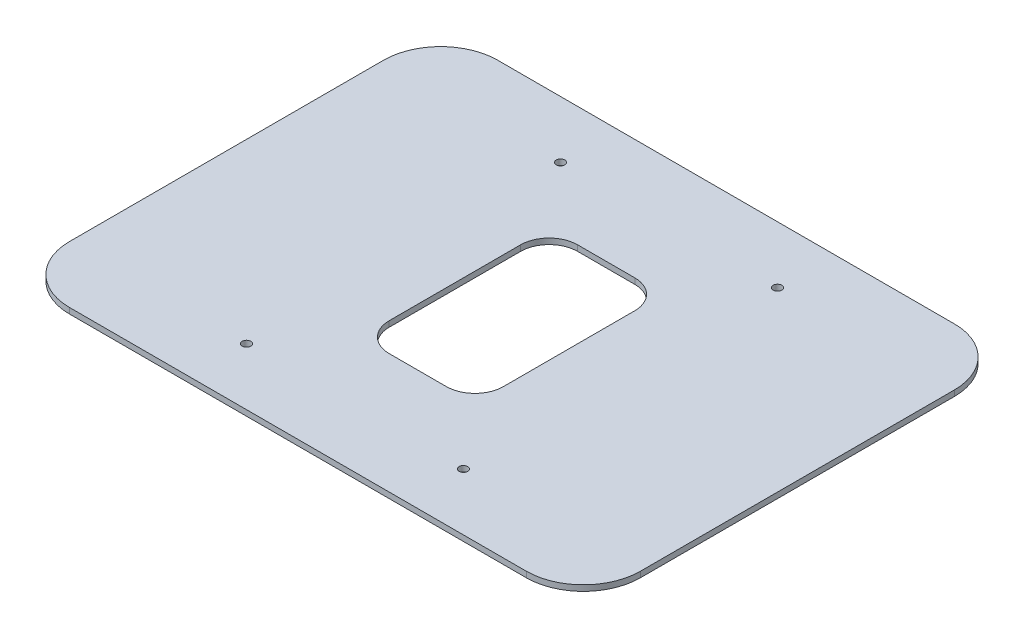
ISO-10303-21;
HEADER;
FILE_DESCRIPTION(('STEP AP214'),'2;1');
FILE_NAME('part.step','',(''),(''),'','','');
FILE_SCHEMA(('AUTOMOTIVE_DESIGN { 1 0 10303 214 1 1 1 1 }'));
ENDSEC;
DATA;
#1=APPLICATION_CONTEXT('core data for automotive mechanical design processes');
#2=APPLICATION_PROTOCOL_DEFINITION('international standard','automotive_design',2000,#1);
#3=PRODUCT_CONTEXT('',#1,'mechanical');
#4=PRODUCT('Part','Part','',(#3));
#5=PRODUCT_RELATED_PRODUCT_CATEGORY('part','',(#4));
#6=PRODUCT_DEFINITION_FORMATION('','',#4);
#7=PRODUCT_DEFINITION_CONTEXT('part definition',#1,'design');
#8=PRODUCT_DEFINITION('design','',#6,#7);
#9=PRODUCT_DEFINITION_SHAPE('','',#8);
#10=(LENGTH_UNIT() NAMED_UNIT(*) SI_UNIT(.MILLI.,.METRE.));
#11=(NAMED_UNIT(*) PLANE_ANGLE_UNIT() SI_UNIT($,.RADIAN.));
#12=(NAMED_UNIT(*) SI_UNIT($,.STERADIAN.) SOLID_ANGLE_UNIT());
#13=UNCERTAINTY_MEASURE_WITH_UNIT(LENGTH_MEASURE(1.E-05),#10,'distance_accuracy_value','');
#14=(GEOMETRIC_REPRESENTATION_CONTEXT(3) GLOBAL_UNCERTAINTY_ASSIGNED_CONTEXT((#13)) GLOBAL_UNIT_ASSIGNED_CONTEXT((#10,
#11,#12)) REPRESENTATION_CONTEXT('',''));
#15=CARTESIAN_POINT('',(0.,0.,0.));
#16=DIRECTION('',(0.,0.,1.));
#17=DIRECTION('',(1.,0.,0.));
#18=AXIS2_PLACEMENT_3D('',#15,#16,#17);
#19=CARTESIAN_POINT('',(119.18397760156,2.,-163.114483400198));
#20=DIRECTION('',(0.,-1.,0.));
#21=DIRECTION('',(0.,0.,-1.));
#22=AXIS2_PLACEMENT_3D('',#19,#20,#21);
#23=CYLINDRICAL_SURFACE('',#22,20.);
#24=CARTESIAN_POINT('',(119.18397760156,0.,-163.114483400198));
#25=DIRECTION('',(0.,1.,0.));
#26=DIRECTION('',(0.,0.,-1.));
#27=AXIS2_PLACEMENT_3D('',#24,#25,#26);
#28=CIRCLE('',#27,20.);
#29=CARTESIAN_POINT('',(139.18397760156,0.,-163.114483400198));
#30=VERTEX_POINT('',#29);
#31=CARTESIAN_POINT('',(119.18397760156,0.,-183.114483400198));
#32=VERTEX_POINT('',#31);
#33=EDGE_CURVE('E227',#30,#32,#28,.T.);
#34=ORIENTED_EDGE('',*,*,#33,.T.);
#35=DIRECTION('',(0.,-1.,0.));
#36=VECTOR('',#35,1.);
#37=CARTESIAN_POINT('',(119.18397760156,2.,-183.114483400198));
#38=LINE('',#37,#36);
#39=CARTESIAN_POINT('',(119.18397760156,2.,-183.114483400198));
#40=VERTEX_POINT('',#39);
#41=EDGE_CURVE('E263',#40,#32,#38,.T.);
#42=ORIENTED_EDGE('',*,*,#41,.F.);
#43=CARTESIAN_POINT('',(119.18397760156,2.,-163.114483400198));
#44=DIRECTION('',(0.,1.,0.));
#45=DIRECTION('',(0.,0.,-1.));
#46=AXIS2_PLACEMENT_3D('',#43,#44,#45);
#47=CIRCLE('',#46,20.);
#48=CARTESIAN_POINT('',(139.18397760156,2.,-163.114483400198));
#49=VERTEX_POINT('',#48);
#50=EDGE_CURVE('E208',#49,#40,#47,.T.);
#51=ORIENTED_EDGE('',*,*,#50,.F.);
#52=DIRECTION('',(0.,-1.,0.));
#53=VECTOR('',#52,1.);
#54=CARTESIAN_POINT('',(139.18397760156,2.,-163.114483400198));
#55=LINE('',#54,#53);
#56=EDGE_CURVE('E226',#49,#30,#55,.T.);
#57=ORIENTED_EDGE('',*,*,#56,.T.);
#58=EDGE_LOOP('',(#34,#42,#51,#57));
#59=FACE_BOUND('',#58,.T.);
#60=ADVANCED_FACE('F33',(#59),#23,.T.);
#61=CARTESIAN_POINT('',(-40.81602239844,2.,-183.114483400198));
#62=DIRECTION('',(0.,0.,1.));
#63=DIRECTION('',(1.,0.,0.));
#64=AXIS2_PLACEMENT_3D('',#61,#62,#63);
#65=PLANE('',#64);
#66=DIRECTION('',(-1.,0.,0.));
#67=VECTOR('',#66,1.);
#68=CARTESIAN_POINT('',(-40.81602239844,0.,-183.114483400198));
#69=LINE('',#68,#67);
#70=CARTESIAN_POINT('',(-40.81602239844,0.,-183.114483400198));
#71=VERTEX_POINT('',#70);
#72=EDGE_CURVE('E230',#32,#71,#69,.T.);
#73=ORIENTED_EDGE('',*,*,#72,.T.);
#74=DIRECTION('',(0.,-1.,0.));
#75=VECTOR('',#74,1.);
#76=CARTESIAN_POINT('',(-40.81602239844,2.,-183.114483400198));
#77=LINE('',#76,#75);
#78=CARTESIAN_POINT('',(-40.81602239844,2.,-183.114483400198));
#79=VERTEX_POINT('',#78);
#80=EDGE_CURVE('E260',#79,#71,#77,.T.);
#81=ORIENTED_EDGE('',*,*,#80,.F.);
#82=DIRECTION('',(-1.,0.,0.));
#83=VECTOR('',#82,1.);
#84=CARTESIAN_POINT('',(-40.81602239844,2.,-183.114483400198));
#85=LINE('',#84,#83);
#86=EDGE_CURVE('E211',#40,#79,#85,.T.);
#87=ORIENTED_EDGE('',*,*,#86,.F.);
#88=ORIENTED_EDGE('',*,*,#41,.T.);
#89=EDGE_LOOP('',(#73,#81,#87,#88));
#90=FACE_BOUND('',#89,.T.);
#91=ADVANCED_FACE('F326',(#90),#65,.F.);
#92=CARTESIAN_POINT('',(-40.81602239844,2.,-163.114483400198));
#93=DIRECTION('',(0.,-1.,0.));
#94=DIRECTION('',(0.,0.,-1.));
#95=AXIS2_PLACEMENT_3D('',#92,#93,#94);
#96=CYLINDRICAL_SURFACE('',#95,20.);
#97=CARTESIAN_POINT('',(-40.81602239844,0.,-163.114483400198));
#98=DIRECTION('',(0.,1.,0.));
#99=DIRECTION('',(0.,0.,1.));
#100=AXIS2_PLACEMENT_3D('',#97,#98,#99);
#101=CIRCLE('',#100,20.);
#102=CARTESIAN_POINT('',(-60.81602239844,0.,-163.114483400198));
#103=VERTEX_POINT('',#102);
#104=EDGE_CURVE('E232',#71,#103,#101,.T.);
#105=ORIENTED_EDGE('',*,*,#104,.T.);
#106=DIRECTION('',(0.,-1.,0.));
#107=VECTOR('',#106,1.);
#108=CARTESIAN_POINT('',(-60.81602239844,2.,-163.114483400198));
#109=LINE('',#108,#107);
#110=CARTESIAN_POINT('',(-60.81602239844,2.,-163.114483400198));
#111=VERTEX_POINT('',#110);
#112=EDGE_CURVE('E257',#111,#103,#109,.T.);
#113=ORIENTED_EDGE('',*,*,#112,.F.);
#114=CARTESIAN_POINT('',(-40.81602239844,2.,-163.114483400198));
#115=DIRECTION('',(0.,1.,0.));
#116=DIRECTION('',(0.,0.,1.));
#117=AXIS2_PLACEMENT_3D('',#114,#115,#116);
#118=CIRCLE('',#117,20.);
#119=EDGE_CURVE('E214',#79,#111,#118,.T.);
#120=ORIENTED_EDGE('',*,*,#119,.F.);
#121=ORIENTED_EDGE('',*,*,#80,.T.);
#122=EDGE_LOOP('',(#105,#113,#120,#121));
#123=FACE_BOUND('',#122,.T.);
#124=ADVANCED_FACE('F331',(#123),#96,.T.);
#125=CARTESIAN_POINT('',(-60.81602239844,2.,-163.114483400198));
#126=DIRECTION('',(1.,0.,0.));
#127=DIRECTION('',(0.,0.,-1.));
#128=AXIS2_PLACEMENT_3D('',#125,#126,#127);
#129=PLANE('',#128);
#130=DIRECTION('',(0.,0.,1.));
#131=VECTOR('',#130,1.);
#132=CARTESIAN_POINT('',(-60.81602239844,0.,-163.114483400198));
#133=LINE('',#132,#131);
#134=CARTESIAN_POINT('',(-60.81602239844,0.,-53.1144834001978));
#135=VERTEX_POINT('',#134);
#136=EDGE_CURVE('E234',#103,#135,#133,.T.);
#137=ORIENTED_EDGE('',*,*,#136,.T.);
#138=DIRECTION('',(0.,-1.,0.));
#139=VECTOR('',#138,1.);
#140=CARTESIAN_POINT('',(-60.81602239844,2.,-53.1144834001978));
#141=LINE('',#140,#139);
#142=CARTESIAN_POINT('',(-60.81602239844,2.,-53.1144834001978));
#143=VERTEX_POINT('',#142);
#144=EDGE_CURVE('E254',#143,#135,#141,.T.);
#145=ORIENTED_EDGE('',*,*,#144,.F.);
#146=DIRECTION('',(0.,0.,1.));
#147=VECTOR('',#146,1.);
#148=CARTESIAN_POINT('',(-60.81602239844,2.,-163.114483400198));
#149=LINE('',#148,#147);
#150=EDGE_CURVE('E216',#111,#143,#149,.T.);
#151=ORIENTED_EDGE('',*,*,#150,.F.);
#152=ORIENTED_EDGE('',*,*,#112,.T.);
#153=EDGE_LOOP('',(#137,#145,#151,#152));
#154=FACE_BOUND('',#153,.T.);
#155=ADVANCED_FACE('F365',(#154),#129,.F.);
#156=CARTESIAN_POINT('',(-40.81602239844,2.,-53.1144834001977));
#157=DIRECTION('',(0.,-1.,0.));
#158=DIRECTION('',(0.,0.,-1.));
#159=AXIS2_PLACEMENT_3D('',#156,#157,#158);
#160=CYLINDRICAL_SURFACE('',#159,20.);
#161=CARTESIAN_POINT('',(-40.81602239844,0.,-53.1144834001977));
#162=DIRECTION('',(0.,1.,0.));
#163=DIRECTION('',(0.,0.,1.));
#164=AXIS2_PLACEMENT_3D('',#161,#162,#163);
#165=CIRCLE('',#164,20.);
#166=CARTESIAN_POINT('',(-40.81602239844,0.,-33.1144834001977));
#167=VERTEX_POINT('',#166);
#168=EDGE_CURVE('E236',#135,#167,#165,.T.);
#169=ORIENTED_EDGE('',*,*,#168,.T.);
#170=DIRECTION('',(0.,-1.,0.));
#171=VECTOR('',#170,1.);
#172=CARTESIAN_POINT('',(-40.81602239844,2.,-33.1144834001977));
#173=LINE('',#172,#171);
#174=CARTESIAN_POINT('',(-40.81602239844,2.,-33.1144834001977));
#175=VERTEX_POINT('',#174);
#176=EDGE_CURVE('E251',#175,#167,#173,.T.);
#177=ORIENTED_EDGE('',*,*,#176,.F.);
#178=CARTESIAN_POINT('',(-40.81602239844,2.,-53.1144834001977));
#179=DIRECTION('',(0.,1.,0.));
#180=DIRECTION('',(0.,0.,1.));
#181=AXIS2_PLACEMENT_3D('',#178,#179,#180);
#182=CIRCLE('',#181,20.);
#183=EDGE_CURVE('E218',#143,#175,#182,.T.);
#184=ORIENTED_EDGE('',*,*,#183,.F.);
#185=ORIENTED_EDGE('',*,*,#144,.T.);
#186=EDGE_LOOP('',(#169,#177,#184,#185));
#187=FACE_BOUND('',#186,.T.);
#188=ADVANCED_FACE('F361',(#187),#160,.T.);
#189=CARTESIAN_POINT('',(-40.8160223984398,2.,-33.1144834001977));
#190=DIRECTION('',(0.,0.,-1.));
#191=DIRECTION('',(-1.,0.,0.));
#192=AXIS2_PLACEMENT_3D('',#189,#190,#191);
#193=PLANE('',#192);
#194=DIRECTION('',(1.,0.,0.));
#195=VECTOR('',#194,1.);
#196=CARTESIAN_POINT('',(-40.8160223984398,0.,-33.1144834001977));
#197=LINE('',#196,#195);
#198=CARTESIAN_POINT('',(119.18397760156,0.,-33.1144834001977));
#199=VERTEX_POINT('',#198);
#200=EDGE_CURVE('E238',#167,#199,#197,.T.);
#201=ORIENTED_EDGE('',*,*,#200,.T.);
#202=DIRECTION('',(0.,-1.,0.));
#203=VECTOR('',#202,1.);
#204=CARTESIAN_POINT('',(119.18397760156,2.,-33.1144834001977));
#205=LINE('',#204,#203);
#206=CARTESIAN_POINT('',(119.18397760156,2.,-33.1144834001977));
#207=VERTEX_POINT('',#206);
#208=EDGE_CURVE('E248',#207,#199,#205,.T.);
#209=ORIENTED_EDGE('',*,*,#208,.F.);
#210=DIRECTION('',(1.,0.,0.));
#211=VECTOR('',#210,1.);
#212=CARTESIAN_POINT('',(-40.8160223984398,2.,-33.1144834001977));
#213=LINE('',#212,#211);
#214=EDGE_CURVE('E220',#175,#207,#213,.T.);
#215=ORIENTED_EDGE('',*,*,#214,.F.);
#216=ORIENTED_EDGE('',*,*,#176,.T.);
#217=EDGE_LOOP('',(#201,#209,#215,#216));
#218=FACE_BOUND('',#217,.T.);
#219=ADVANCED_FACE('F356',(#218),#193,.F.);
#220=CARTESIAN_POINT('',(119.18397760156,2.,-53.1144834001977));
#221=DIRECTION('',(0.,-1.,0.));
#222=DIRECTION('',(0.,0.,-1.));
#223=AXIS2_PLACEMENT_3D('',#220,#221,#222);
#224=CYLINDRICAL_SURFACE('',#223,20.);
#225=CARTESIAN_POINT('',(119.18397760156,0.,-53.1144834001977));
#226=DIRECTION('',(0.,1.,0.));
#227=DIRECTION('',(0.,0.,1.));
#228=AXIS2_PLACEMENT_3D('',#225,#226,#227);
#229=CIRCLE('',#228,20.);
#230=CARTESIAN_POINT('',(139.18397760156,0.,-53.1144834001977));
#231=VERTEX_POINT('',#230);
#232=EDGE_CURVE('E240',#199,#231,#229,.T.);
#233=ORIENTED_EDGE('',*,*,#232,.T.);
#234=DIRECTION('',(0.,-1.,0.));
#235=VECTOR('',#234,1.);
#236=CARTESIAN_POINT('',(139.18397760156,2.,-53.1144834001977));
#237=LINE('',#236,#235);
#238=CARTESIAN_POINT('',(139.18397760156,2.,-53.1144834001977));
#239=VERTEX_POINT('',#238);
#240=EDGE_CURVE('E245',#239,#231,#237,.T.);
#241=ORIENTED_EDGE('',*,*,#240,.F.);
#242=CARTESIAN_POINT('',(119.18397760156,2.,-53.1144834001977));
#243=DIRECTION('',(0.,1.,0.));
#244=DIRECTION('',(0.,0.,1.));
#245=AXIS2_PLACEMENT_3D('',#242,#243,#244);
#246=CIRCLE('',#245,20.);
#247=EDGE_CURVE('E222',#207,#239,#246,.T.);
#248=ORIENTED_EDGE('',*,*,#247,.F.);
#249=ORIENTED_EDGE('',*,*,#208,.T.);
#250=EDGE_LOOP('',(#233,#241,#248,#249));
#251=FACE_BOUND('',#250,.T.);
#252=ADVANCED_FACE('F351',(#251),#224,.T.);
#253=CARTESIAN_POINT('',(139.18397760156,2.,-163.114483400198));
#254=DIRECTION('',(-1.,0.,0.));
#255=DIRECTION('',(0.,0.,1.));
#256=AXIS2_PLACEMENT_3D('',#253,#254,#255);
#257=PLANE('',#256);
#258=DIRECTION('',(0.,0.,-1.));
#259=VECTOR('',#258,1.);
#260=CARTESIAN_POINT('',(139.18397760156,0.,-163.114483400198));
#261=LINE('',#260,#259);
#262=EDGE_CURVE('E212',#231,#30,#261,.T.);
#263=ORIENTED_EDGE('',*,*,#262,.T.);
#264=ORIENTED_EDGE('',*,*,#56,.F.);
#265=DIRECTION('',(0.,0.,-1.));
#266=VECTOR('',#265,1.);
#267=CARTESIAN_POINT('',(139.18397760156,2.,-163.114483400198));
#268=LINE('',#267,#266);
#269=EDGE_CURVE('E224',#239,#49,#268,.T.);
#270=ORIENTED_EDGE('',*,*,#269,.F.);
#271=ORIENTED_EDGE('',*,*,#240,.T.);
#272=EDGE_LOOP('',(#263,#264,#270,#271));
#273=FACE_BOUND('',#272,.T.);
#274=ADVANCED_FACE('F349',(#273),#257,.F.);
#275=CARTESIAN_POINT('',(119.18397760156,2.,-163.114483400198));
#276=DIRECTION('',(0.,-1.,0.));
#277=DIRECTION('',(0.,0.,-1.));
#278=AXIS2_PLACEMENT_3D('',#275,#276,#277);
#279=PLANE('',#278);
#280=DIRECTION('',(-1.,0.,0.));
#281=VECTOR('',#280,1.);
#282=CARTESIAN_POINT('',(29.1839776015601,2.,-141.114483400198));
#283=LINE('',#282,#281);
#284=CARTESIAN_POINT('',(49.1839776015599,2.,-141.114483400198));
#285=VERTEX_POINT('',#284);
#286=CARTESIAN_POINT('',(29.1839776015601,2.,-141.114483400198));
#287=VERTEX_POINT('',#286);
#288=EDGE_CURVE('E156',#285,#287,#283,.T.);
#289=ORIENTED_EDGE('',*,*,#288,.F.);
#290=CARTESIAN_POINT('',(49.18397760156,2.,-131.114483400198));
#291=DIRECTION('',(0.,1.,0.));
#292=DIRECTION('',(0.,0.,-1.));
#293=AXIS2_PLACEMENT_3D('',#290,#291,#292);
#294=CIRCLE('',#293,10.);
#295=CARTESIAN_POINT('',(59.18397760156,2.,-131.114483400198));
#296=VERTEX_POINT('',#295);
#297=EDGE_CURVE('E47',#296,#285,#294,.T.);
#298=ORIENTED_EDGE('',*,*,#297,.F.);
#299=DIRECTION('',(0.,0.,-1.));
#300=VECTOR('',#299,1.);
#301=CARTESIAN_POINT('',(59.18397760156,2.,-131.114483400198));
#302=LINE('',#301,#300);
#303=CARTESIAN_POINT('',(59.18397760156,2.,-85.1144834001978));
#304=VERTEX_POINT('',#303);
#305=EDGE_CURVE('E178',#304,#296,#302,.T.);
#306=ORIENTED_EDGE('',*,*,#305,.F.);
#307=CARTESIAN_POINT('',(49.18397760156,2.,-85.1144834001977));
#308=DIRECTION('',(0.,1.,0.));
#309=DIRECTION('',(0.,0.,1.));
#310=AXIS2_PLACEMENT_3D('',#307,#308,#309);
#311=CIRCLE('',#310,10.);
#312=CARTESIAN_POINT('',(49.1839776015599,2.,-75.1144834001977));
#313=VERTEX_POINT('',#312);
#314=EDGE_CURVE('E175',#313,#304,#311,.T.);
#315=ORIENTED_EDGE('',*,*,#314,.F.);
#316=DIRECTION('',(1.,0.,0.));
#317=VECTOR('',#316,1.);
#318=CARTESIAN_POINT('',(29.1839776015601,2.,-75.1144834001977));
#319=LINE('',#318,#317);
#320=CARTESIAN_POINT('',(29.18397760156,2.,-75.1144834001977));
#321=VERTEX_POINT('',#320);
#322=EDGE_CURVE('E172',#321,#313,#319,.T.);
#323=ORIENTED_EDGE('',*,*,#322,.F.);
#324=CARTESIAN_POINT('',(29.18397760156,2.,-85.1144834001977));
#325=DIRECTION('',(0.,1.,0.));
#326=DIRECTION('',(0.,0.,1.));
#327=AXIS2_PLACEMENT_3D('',#324,#325,#326);
#328=CIRCLE('',#327,10.);
#329=CARTESIAN_POINT('',(19.18397760156,2.,-85.1144834001978));
#330=VERTEX_POINT('',#329);
#331=EDGE_CURVE('E166',#330,#321,#328,.T.);
#332=ORIENTED_EDGE('',*,*,#331,.F.);
#333=DIRECTION('',(0.,0.,1.));
#334=VECTOR('',#333,1.);
#335=CARTESIAN_POINT('',(19.18397760156,2.,-131.114483400198));
#336=LINE('',#335,#334);
#337=CARTESIAN_POINT('',(19.18397760156,2.,-131.114483400198));
#338=VERTEX_POINT('',#337);
#339=EDGE_CURVE('E164',#338,#330,#336,.T.);
#340=ORIENTED_EDGE('',*,*,#339,.F.);
#341=CARTESIAN_POINT('',(29.18397760156,2.,-131.114483400198));
#342=DIRECTION('',(0.,1.,0.));
#343=DIRECTION('',(0.,0.,1.));
#344=AXIS2_PLACEMENT_3D('',#341,#342,#343);
#345=CIRCLE('',#344,10.);
#346=EDGE_CURVE('E147',#287,#338,#345,.T.);
#347=ORIENTED_EDGE('',*,*,#346,.F.);
#348=EDGE_LOOP('',(#289,#298,#306,#315,#323,#332,#340,#347));
#349=FACE_BOUND('',#348,.T.);
#350=CARTESIAN_POINT('',(77.18397760156,2.,-163.114483400198));
#351=DIRECTION('',(0.,1.,0.));
#352=DIRECTION('',(0.,0.,1.));
#353=AXIS2_PLACEMENT_3D('',#350,#351,#352);
#354=CIRCLE('',#353,1.5);
#355=CARTESIAN_POINT('',(77.18397760156,2.,-161.614483400198));
#356=VERTEX_POINT('',#355);
#357=EDGE_CURVE('E194',#356,#356,#354,.T.);
#358=ORIENTED_EDGE('',*,*,#357,.F.);
#359=EDGE_LOOP('',(#358));
#360=FACE_BOUND('',#359,.T.);
#361=CARTESIAN_POINT('',(77.18397760156,2.,-53.1144834001977));
#362=DIRECTION('',(0.,1.,0.));
#363=DIRECTION('',(0.,0.,1.));
#364=AXIS2_PLACEMENT_3D('',#361,#362,#363);
#365=CIRCLE('',#364,1.5);
#366=CARTESIAN_POINT('',(77.18397760156,2.,-51.6144834001977));
#367=VERTEX_POINT('',#366);
#368=EDGE_CURVE('E198',#367,#367,#365,.T.);
#369=ORIENTED_EDGE('',*,*,#368,.F.);
#370=EDGE_LOOP('',(#369));
#371=FACE_BOUND('',#370,.T.);
#372=CARTESIAN_POINT('',(1.18397760156001,2.,-53.1144834001977));
#373=DIRECTION('',(0.,1.,0.));
#374=DIRECTION('',(0.,0.,1.));
#375=AXIS2_PLACEMENT_3D('',#372,#373,#374);
#376=CIRCLE('',#375,1.5);
#377=CARTESIAN_POINT('',(1.18397760156001,2.,-51.6144834001977));
#378=VERTEX_POINT('',#377);
#379=EDGE_CURVE('E183',#378,#378,#376,.T.);
#380=ORIENTED_EDGE('',*,*,#379,.F.);
#381=EDGE_LOOP('',(#380));
#382=FACE_BOUND('',#381,.T.);
#383=CARTESIAN_POINT('',(1.18397760156001,2.,-163.114483400198));
#384=DIRECTION('',(0.,1.,0.));
#385=DIRECTION('',(0.,0.,1.));
#386=AXIS2_PLACEMENT_3D('',#383,#384,#385);
#387=CIRCLE('',#386,1.5);
#388=CARTESIAN_POINT('',(1.18397760156001,2.,-161.614483400198));
#389=VERTEX_POINT('',#388);
#390=EDGE_CURVE('E203',#389,#389,#387,.T.);
#391=ORIENTED_EDGE('',*,*,#390,.F.);
#392=EDGE_LOOP('',(#391));
#393=FACE_BOUND('',#392,.T.);
#394=ORIENTED_EDGE('',*,*,#50,.T.);
#395=ORIENTED_EDGE('',*,*,#86,.T.);
#396=ORIENTED_EDGE('',*,*,#119,.T.);
#397=ORIENTED_EDGE('',*,*,#150,.T.);
#398=ORIENTED_EDGE('',*,*,#183,.T.);
#399=ORIENTED_EDGE('',*,*,#214,.T.);
#400=ORIENTED_EDGE('',*,*,#247,.T.);
#401=ORIENTED_EDGE('',*,*,#269,.T.);
#402=EDGE_LOOP('',(#394,#395,#396,#397,#398,#399,#400,#401));
#403=FACE_BOUND('',#402,.T.);
#404=ADVANCED_FACE('F160',(#349,#360,#371,#382,#393,#403),#279,.F.);
#405=CARTESIAN_POINT('',(119.18397760156,0.,-163.114483400198));
#406=DIRECTION('',(0.,-1.,0.));
#407=DIRECTION('',(0.,0.,-1.));
#408=AXIS2_PLACEMENT_3D('',#405,#406,#407);
#409=PLANE('',#408);
#410=CARTESIAN_POINT('',(49.18397760156,0.,-131.114483400198));
#411=DIRECTION('',(0.,-1.,0.));
#412=DIRECTION('',(0.,0.,-1.));
#413=AXIS2_PLACEMENT_3D('',#410,#411,#412);
#414=CIRCLE('',#413,10.);
#415=CARTESIAN_POINT('',(49.1839776015599,0.,-141.114483400198));
#416=VERTEX_POINT('',#415);
#417=CARTESIAN_POINT('',(59.18397760156,0.,-131.114483400198));
#418=VERTEX_POINT('',#417);
#419=EDGE_CURVE('E11',#416,#418,#414,.T.);
#420=ORIENTED_EDGE('',*,*,#419,.F.);
#421=DIRECTION('',(1.,0.,0.));
#422=VECTOR('',#421,1.);
#423=CARTESIAN_POINT('',(119.18397760156,0.,-141.114483400198));
#424=LINE('',#423,#422);
#425=CARTESIAN_POINT('',(29.1839776015601,0.,-141.114483400198));
#426=VERTEX_POINT('',#425);
#427=EDGE_CURVE('E266',#426,#416,#424,.T.);
#428=ORIENTED_EDGE('',*,*,#427,.F.);
#429=CARTESIAN_POINT('',(29.18397760156,0.,-131.114483400198));
#430=DIRECTION('',(0.,-1.,0.));
#431=DIRECTION('',(0.,0.,-1.));
#432=AXIS2_PLACEMENT_3D('',#429,#430,#431);
#433=CIRCLE('',#432,10.);
#434=CARTESIAN_POINT('',(19.18397760156,0.,-131.114483400198));
#435=VERTEX_POINT('',#434);
#436=EDGE_CURVE('E150',#435,#426,#433,.T.);
#437=ORIENTED_EDGE('',*,*,#436,.F.);
#438=DIRECTION('',(0.,0.,-1.));
#439=VECTOR('',#438,1.);
#440=CARTESIAN_POINT('',(19.18397760156,0.,-163.114483400198));
#441=LINE('',#440,#439);
#442=CARTESIAN_POINT('',(19.18397760156,0.,-85.1144834001978));
#443=VERTEX_POINT('',#442);
#444=EDGE_CURVE('E278',#443,#435,#441,.T.);
#445=ORIENTED_EDGE('',*,*,#444,.F.);
#446=CARTESIAN_POINT('',(29.18397760156,0.,-85.1144834001977));
#447=DIRECTION('',(0.,-1.,0.));
#448=DIRECTION('',(0.,0.,-1.));
#449=AXIS2_PLACEMENT_3D('',#446,#447,#448);
#450=CIRCLE('',#449,10.);
#451=CARTESIAN_POINT('',(29.18397760156,0.,-75.1144834001977));
#452=VERTEX_POINT('',#451);
#453=EDGE_CURVE('E280',#452,#443,#450,.T.);
#454=ORIENTED_EDGE('',*,*,#453,.F.);
#455=DIRECTION('',(-1.,0.,0.));
#456=VECTOR('',#455,1.);
#457=CARTESIAN_POINT('',(119.18397760156,0.,-75.1144834001977));
#458=LINE('',#457,#456);
#459=CARTESIAN_POINT('',(49.1839776015599,0.,-75.1144834001977));
#460=VERTEX_POINT('',#459);
#461=EDGE_CURVE('E282',#460,#452,#458,.T.);
#462=ORIENTED_EDGE('',*,*,#461,.F.);
#463=CARTESIAN_POINT('',(49.18397760156,0.,-85.1144834001977));
#464=DIRECTION('',(0.,-1.,0.));
#465=DIRECTION('',(0.,0.,-1.));
#466=AXIS2_PLACEMENT_3D('',#463,#464,#465);
#467=CIRCLE('',#466,10.);
#468=CARTESIAN_POINT('',(59.18397760156,0.,-85.1144834001978));
#469=VERTEX_POINT('',#468);
#470=EDGE_CURVE('E284',#469,#460,#467,.T.);
#471=ORIENTED_EDGE('',*,*,#470,.F.);
#472=DIRECTION('',(0.,0.,1.));
#473=VECTOR('',#472,1.);
#474=CARTESIAN_POINT('',(59.18397760156,0.,-163.114483400198));
#475=LINE('',#474,#473);
#476=EDGE_CURVE('E40',#418,#469,#475,.T.);
#477=ORIENTED_EDGE('',*,*,#476,.F.);
#478=EDGE_LOOP('',(#420,#428,#437,#445,#454,#462,#471,#477));
#479=FACE_BOUND('',#478,.T.);
#480=CARTESIAN_POINT('',(77.18397760156,0.,-163.114483400198));
#481=DIRECTION('',(0.,-1.,0.));
#482=DIRECTION('',(0.,0.,-1.));
#483=AXIS2_PLACEMENT_3D('',#480,#481,#482);
#484=CIRCLE('',#483,1.5);
#485=CARTESIAN_POINT('',(77.18397760156,0.,-164.614483400198));
#486=VERTEX_POINT('',#485);
#487=EDGE_CURVE('E207',#486,#486,#484,.T.);
#488=ORIENTED_EDGE('',*,*,#487,.F.);
#489=EDGE_LOOP('',(#488));
#490=FACE_BOUND('',#489,.T.);
#491=CARTESIAN_POINT('',(77.18397760156,0.,-53.1144834001977));
#492=DIRECTION('',(0.,-1.,0.));
#493=DIRECTION('',(0.,0.,-1.));
#494=AXIS2_PLACEMENT_3D('',#491,#492,#493);
#495=CIRCLE('',#494,1.5);
#496=CARTESIAN_POINT('',(77.18397760156,0.,-54.6144834001977));
#497=VERTEX_POINT('',#496);
#498=EDGE_CURVE('E271',#497,#497,#495,.T.);
#499=ORIENTED_EDGE('',*,*,#498,.F.);
#500=EDGE_LOOP('',(#499));
#501=FACE_BOUND('',#500,.T.);
#502=CARTESIAN_POINT('',(1.18397760156001,0.,-53.1144834001977));
#503=DIRECTION('',(0.,-1.,0.));
#504=DIRECTION('',(0.,0.,-1.));
#505=AXIS2_PLACEMENT_3D('',#502,#503,#504);
#506=CIRCLE('',#505,1.5);
#507=CARTESIAN_POINT('',(1.18397760156001,0.,-54.6144834001977));
#508=VERTEX_POINT('',#507);
#509=EDGE_CURVE('E197',#508,#508,#506,.T.);
#510=ORIENTED_EDGE('',*,*,#509,.F.);
#511=EDGE_LOOP('',(#510));
#512=FACE_BOUND('',#511,.T.);
#513=CARTESIAN_POINT('',(1.18397760156001,0.,-163.114483400198));
#514=DIRECTION('',(0.,-1.,0.));
#515=DIRECTION('',(0.,0.,-1.));
#516=AXIS2_PLACEMENT_3D('',#513,#514,#515);
#517=CIRCLE('',#516,1.5);
#518=CARTESIAN_POINT('',(1.18397760156001,0.,-164.614483400198));
#519=VERTEX_POINT('',#518);
#520=EDGE_CURVE('E206',#519,#519,#517,.T.);
#521=ORIENTED_EDGE('',*,*,#520,.F.);
#522=EDGE_LOOP('',(#521));
#523=FACE_BOUND('',#522,.T.);
#524=ORIENTED_EDGE('',*,*,#33,.F.);
#525=ORIENTED_EDGE('',*,*,#262,.F.);
#526=ORIENTED_EDGE('',*,*,#232,.F.);
#527=ORIENTED_EDGE('',*,*,#200,.F.);
#528=ORIENTED_EDGE('',*,*,#168,.F.);
#529=ORIENTED_EDGE('',*,*,#136,.F.);
#530=ORIENTED_EDGE('',*,*,#104,.F.);
#531=ORIENTED_EDGE('',*,*,#72,.F.);
#532=EDGE_LOOP('',(#524,#525,#526,#527,#528,#529,#530,#531));
#533=FACE_BOUND('',#532,.T.);
#534=ADVANCED_FACE('F299',(#479,#490,#501,#512,#523,#533),#409,.T.);
#535=CARTESIAN_POINT('',(1.18397760156001,-8.,-163.114483400198));
#536=DIRECTION('',(0.,1.,0.));
#537=DIRECTION('',(0.,0.,1.));
#538=AXIS2_PLACEMENT_3D('',#535,#536,#537);
#539=CYLINDRICAL_SURFACE('',#538,1.5);
#540=ORIENTED_EDGE('',*,*,#520,.T.);
#541=EDGE_LOOP('',(#540));
#542=FACE_BOUND('',#541,.T.);
#543=ORIENTED_EDGE('',*,*,#390,.T.);
#544=EDGE_LOOP('',(#543));
#545=FACE_BOUND('',#544,.T.);
#546=ADVANCED_FACE('F385',(#542,#545),#539,.F.);
#547=CARTESIAN_POINT('',(1.18397760156001,-8.,-53.1144834001977));
#548=DIRECTION('',(0.,1.,0.));
#549=DIRECTION('',(0.,0.,1.));
#550=AXIS2_PLACEMENT_3D('',#547,#548,#549);
#551=CYLINDRICAL_SURFACE('',#550,1.5);
#552=ORIENTED_EDGE('',*,*,#509,.T.);
#553=EDGE_LOOP('',(#552));
#554=FACE_BOUND('',#553,.T.);
#555=ORIENTED_EDGE('',*,*,#379,.T.);
#556=EDGE_LOOP('',(#555));
#557=FACE_BOUND('',#556,.T.);
#558=ADVANCED_FACE('F390',(#554,#557),#551,.F.);
#559=CARTESIAN_POINT('',(77.18397760156,-8.,-53.1144834001977));
#560=DIRECTION('',(0.,1.,0.));
#561=DIRECTION('',(0.,0.,1.));
#562=AXIS2_PLACEMENT_3D('',#559,#560,#561);
#563=CYLINDRICAL_SURFACE('',#562,1.5);
#564=ORIENTED_EDGE('',*,*,#498,.T.);
#565=EDGE_LOOP('',(#564));
#566=FACE_BOUND('',#565,.T.);
#567=ORIENTED_EDGE('',*,*,#368,.T.);
#568=EDGE_LOOP('',(#567));
#569=FACE_BOUND('',#568,.T.);
#570=ADVANCED_FACE('F321',(#566,#569),#563,.F.);
#571=CARTESIAN_POINT('',(77.18397760156,-8.,-163.114483400198));
#572=DIRECTION('',(0.,1.,0.));
#573=DIRECTION('',(0.,0.,1.));
#574=AXIS2_PLACEMENT_3D('',#571,#572,#573);
#575=CYLINDRICAL_SURFACE('',#574,1.5);
#576=ORIENTED_EDGE('',*,*,#487,.T.);
#577=EDGE_LOOP('',(#576));
#578=FACE_BOUND('',#577,.T.);
#579=ORIENTED_EDGE('',*,*,#357,.T.);
#580=EDGE_LOOP('',(#579));
#581=FACE_BOUND('',#580,.T.);
#582=ADVANCED_FACE('F314',(#578,#581),#575,.F.);
#583=CARTESIAN_POINT('',(49.18397760156,-8.,-131.114483400198));
#584=DIRECTION('',(0.,1.,0.));
#585=DIRECTION('',(0.,0.,1.));
#586=AXIS2_PLACEMENT_3D('',#583,#584,#585);
#587=CYLINDRICAL_SURFACE('',#586,10.);
#588=ORIENTED_EDGE('',*,*,#419,.T.);
#589=DIRECTION('',(0.,1.,0.));
#590=VECTOR('',#589,1.);
#591=CARTESIAN_POINT('',(59.18397760156,-8.,-131.114483400198));
#592=LINE('',#591,#590);
#593=EDGE_CURVE('E181',#418,#296,#592,.T.);
#594=ORIENTED_EDGE('',*,*,#593,.T.);
#595=ORIENTED_EDGE('',*,*,#297,.T.);
#596=DIRECTION('',(0.,1.,0.));
#597=VECTOR('',#596,1.);
#598=CARTESIAN_POINT('',(49.1839776015599,-8.,-141.114483400198));
#599=LINE('',#598,#597);
#600=EDGE_CURVE('E153',#416,#285,#599,.T.);
#601=ORIENTED_EDGE('',*,*,#600,.F.);
#602=EDGE_LOOP('',(#588,#594,#595,#601));
#603=FACE_BOUND('',#602,.T.);
#604=ADVANCED_FACE('F312',(#603),#587,.F.);
#605=CARTESIAN_POINT('',(59.18397760156,-8.,-131.114483400198));
#606=DIRECTION('',(1.,0.,0.));
#607=DIRECTION('',(0.,0.,-1.));
#608=AXIS2_PLACEMENT_3D('',#605,#606,#607);
#609=PLANE('',#608);
#610=ORIENTED_EDGE('',*,*,#476,.T.);
#611=DIRECTION('',(0.,1.,0.));
#612=VECTOR('',#611,1.);
#613=CARTESIAN_POINT('',(59.18397760156,-8.,-85.1144834001978));
#614=LINE('',#613,#612);
#615=EDGE_CURVE('E184',#469,#304,#614,.T.);
#616=ORIENTED_EDGE('',*,*,#615,.T.);
#617=ORIENTED_EDGE('',*,*,#305,.T.);
#618=ORIENTED_EDGE('',*,*,#593,.F.);
#619=EDGE_LOOP('',(#610,#616,#617,#618));
#620=FACE_BOUND('',#619,.T.);
#621=ADVANCED_FACE('F289',(#620),#609,.F.);
#622=CARTESIAN_POINT('',(49.18397760156,-8.,-85.1144834001977));
#623=DIRECTION('',(0.,1.,0.));
#624=DIRECTION('',(0.,0.,1.));
#625=AXIS2_PLACEMENT_3D('',#622,#623,#624);
#626=CYLINDRICAL_SURFACE('',#625,10.);
#627=ORIENTED_EDGE('',*,*,#470,.T.);
#628=DIRECTION('',(0.,1.,0.));
#629=VECTOR('',#628,1.);
#630=CARTESIAN_POINT('',(49.1839776015599,-8.,-75.1144834001977));
#631=LINE('',#630,#629);
#632=EDGE_CURVE('E186',#460,#313,#631,.T.);
#633=ORIENTED_EDGE('',*,*,#632,.T.);
#634=ORIENTED_EDGE('',*,*,#314,.T.);
#635=ORIENTED_EDGE('',*,*,#615,.F.);
#636=EDGE_LOOP('',(#627,#633,#634,#635));
#637=FACE_BOUND('',#636,.T.);
#638=ADVANCED_FACE('F294',(#637),#626,.F.);
#639=CARTESIAN_POINT('',(29.1839776015601,-8.,-75.1144834001977));
#640=DIRECTION('',(0.,0.,1.));
#641=DIRECTION('',(1.,0.,0.));
#642=AXIS2_PLACEMENT_3D('',#639,#640,#641);
#643=PLANE('',#642);
#644=ORIENTED_EDGE('',*,*,#461,.T.);
#645=DIRECTION('',(0.,1.,0.));
#646=VECTOR('',#645,1.);
#647=CARTESIAN_POINT('',(29.18397760156,-8.,-75.1144834001977));
#648=LINE('',#647,#646);
#649=EDGE_CURVE('E188',#452,#321,#648,.T.);
#650=ORIENTED_EDGE('',*,*,#649,.T.);
#651=ORIENTED_EDGE('',*,*,#322,.T.);
#652=ORIENTED_EDGE('',*,*,#632,.F.);
#653=EDGE_LOOP('',(#644,#650,#651,#652));
#654=FACE_BOUND('',#653,.T.);
#655=ADVANCED_FACE('F305',(#654),#643,.F.);
#656=CARTESIAN_POINT('',(29.18397760156,-8.,-85.1144834001977));
#657=DIRECTION('',(0.,1.,0.));
#658=DIRECTION('',(0.,0.,1.));
#659=AXIS2_PLACEMENT_3D('',#656,#657,#658);
#660=CYLINDRICAL_SURFACE('',#659,10.);
#661=ORIENTED_EDGE('',*,*,#453,.T.);
#662=DIRECTION('',(0.,1.,0.));
#663=VECTOR('',#662,1.);
#664=CARTESIAN_POINT('',(19.18397760156,-8.,-85.1144834001978));
#665=LINE('',#664,#663);
#666=EDGE_CURVE('E190',#443,#330,#665,.T.);
#667=ORIENTED_EDGE('',*,*,#666,.T.);
#668=ORIENTED_EDGE('',*,*,#331,.T.);
#669=ORIENTED_EDGE('',*,*,#649,.F.);
#670=EDGE_LOOP('',(#661,#667,#668,#669));
#671=FACE_BOUND('',#670,.T.);
#672=ADVANCED_FACE('F307',(#671),#660,.F.);
#673=CARTESIAN_POINT('',(19.18397760156,-8.,-131.114483400198));
#674=DIRECTION('',(-1.,0.,0.));
#675=DIRECTION('',(0.,0.,1.));
#676=AXIS2_PLACEMENT_3D('',#673,#674,#675);
#677=PLANE('',#676);
#678=ORIENTED_EDGE('',*,*,#444,.T.);
#679=DIRECTION('',(0.,1.,0.));
#680=VECTOR('',#679,1.);
#681=CARTESIAN_POINT('',(19.18397760156,-8.,-131.114483400198));
#682=LINE('',#681,#680);
#683=EDGE_CURVE('E152',#435,#338,#682,.T.);
#684=ORIENTED_EDGE('',*,*,#683,.T.);
#685=ORIENTED_EDGE('',*,*,#339,.T.);
#686=ORIENTED_EDGE('',*,*,#666,.F.);
#687=EDGE_LOOP('',(#678,#684,#685,#686));
#688=FACE_BOUND('',#687,.T.);
#689=ADVANCED_FACE('F311',(#688),#677,.F.);
#690=CARTESIAN_POINT('',(29.18397760156,-8.,-131.114483400198));
#691=DIRECTION('',(0.,1.,0.));
#692=DIRECTION('',(0.,0.,1.));
#693=AXIS2_PLACEMENT_3D('',#690,#691,#692);
#694=CYLINDRICAL_SURFACE('',#693,10.);
#695=ORIENTED_EDGE('',*,*,#436,.T.);
#696=DIRECTION('',(0.,1.,0.));
#697=VECTOR('',#696,1.);
#698=CARTESIAN_POINT('',(29.1839776015601,-8.,-141.114483400198));
#699=LINE('',#698,#697);
#700=EDGE_CURVE('E55',#426,#287,#699,.T.);
#701=ORIENTED_EDGE('',*,*,#700,.T.);
#702=ORIENTED_EDGE('',*,*,#346,.T.);
#703=ORIENTED_EDGE('',*,*,#683,.F.);
#704=EDGE_LOOP('',(#695,#701,#702,#703));
#705=FACE_BOUND('',#704,.T.);
#706=ADVANCED_FACE('F144',(#705),#694,.F.);
#707=CARTESIAN_POINT('',(29.1839776015601,-8.,-141.114483400198));
#708=DIRECTION('',(0.,0.,-1.));
#709=DIRECTION('',(-1.,0.,0.));
#710=AXIS2_PLACEMENT_3D('',#707,#708,#709);
#711=PLANE('',#710);
#712=ORIENTED_EDGE('',*,*,#427,.T.);
#713=ORIENTED_EDGE('',*,*,#600,.T.);
#714=ORIENTED_EDGE('',*,*,#288,.T.);
#715=ORIENTED_EDGE('',*,*,#700,.F.);
#716=EDGE_LOOP('',(#712,#713,#714,#715));
#717=FACE_BOUND('',#716,.T.);
#718=ADVANCED_FACE('F157',(#717),#711,.F.);
#719=CLOSED_SHELL('',(#60,#91,#124,#155,#188,#219,#252,#274,#404,#534,#546,#558,#570,#582,#604,
#621,#638,#655,#672,#689,#706,#718));
#720=MANIFOLD_SOLID_BREP('B2',#719);
#721=ADVANCED_BREP_SHAPE_REPRESENTATION('',(#18,#720),#14);
#722=SHAPE_DEFINITION_REPRESENTATION(#9,#721);
ENDSEC;
END-ISO-10303-21;
